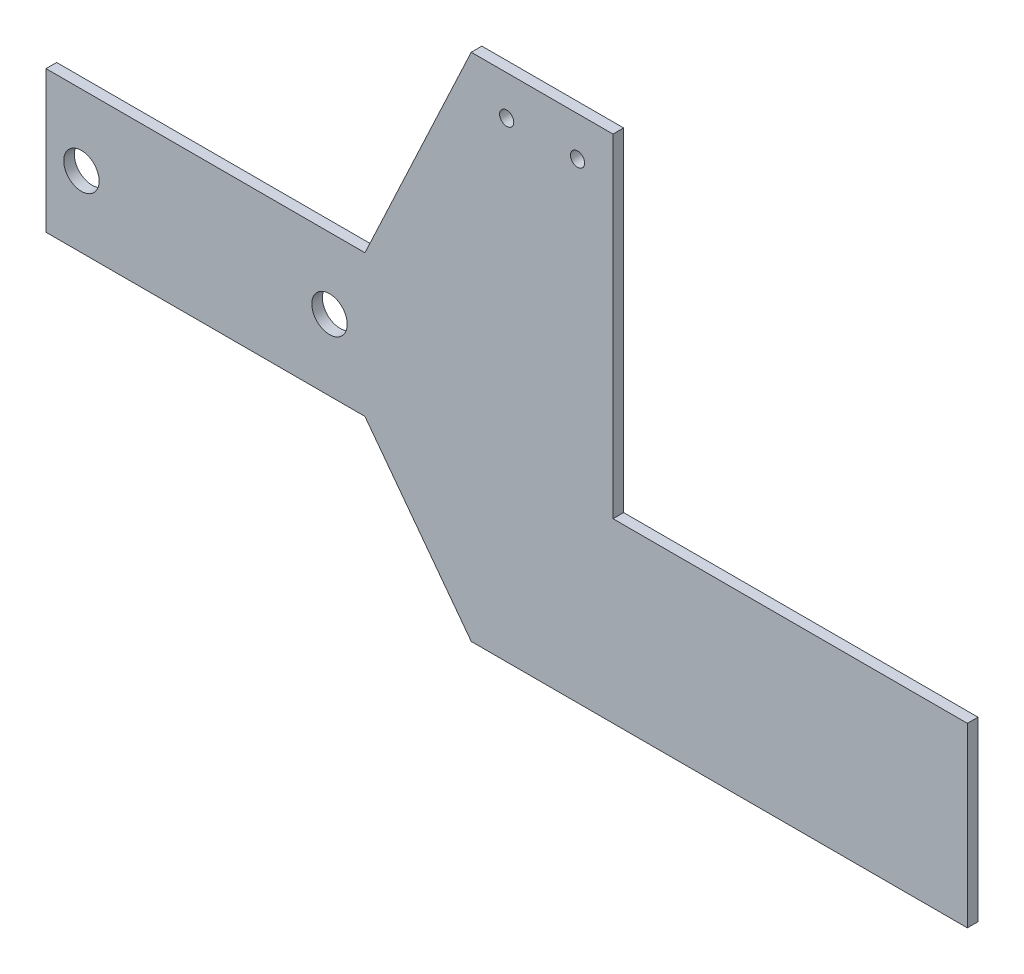
ISO-10303-21;
HEADER;
FILE_DESCRIPTION(('STEP AP214'),'2;1');
FILE_NAME('part.step','',(''),(''),'','','');
FILE_SCHEMA(('AUTOMOTIVE_DESIGN { 1 0 10303 214 1 1 1 1 }'));
ENDSEC;
DATA;
#1=APPLICATION_CONTEXT('core data for automotive mechanical design processes');
#2=APPLICATION_PROTOCOL_DEFINITION('international standard','automotive_design',2000,#1);
#3=PRODUCT_CONTEXT('',#1,'mechanical');
#4=PRODUCT('Part','Part','',(#3));
#5=PRODUCT_RELATED_PRODUCT_CATEGORY('part','',(#4));
#6=PRODUCT_DEFINITION_FORMATION('','',#4);
#7=PRODUCT_DEFINITION_CONTEXT('part definition',#1,'design');
#8=PRODUCT_DEFINITION('design','',#6,#7);
#9=PRODUCT_DEFINITION_SHAPE('','',#8);
#10=(LENGTH_UNIT() NAMED_UNIT(*) SI_UNIT(.MILLI.,.METRE.));
#11=(NAMED_UNIT(*) PLANE_ANGLE_UNIT() SI_UNIT($,.RADIAN.));
#12=(NAMED_UNIT(*) SI_UNIT($,.STERADIAN.) SOLID_ANGLE_UNIT());
#13=UNCERTAINTY_MEASURE_WITH_UNIT(LENGTH_MEASURE(1.E-05),#10,'distance_accuracy_value','');
#14=(GEOMETRIC_REPRESENTATION_CONTEXT(3) GLOBAL_UNCERTAINTY_ASSIGNED_CONTEXT((#13)) GLOBAL_UNIT_ASSIGNED_CONTEXT((#10,
#11,#12)) REPRESENTATION_CONTEXT('',''));
#15=CARTESIAN_POINT('',(0.,0.,0.));
#16=DIRECTION('',(0.,0.,1.));
#17=DIRECTION('',(1.,0.,0.));
#18=AXIS2_PLACEMENT_3D('',#15,#16,#17);
#19=CARTESIAN_POINT('',(0.,40.,1.5));
#20=DIRECTION('',(0.,-1.,0.));
#21=DIRECTION('',(0.,0.,-1.));
#22=AXIS2_PLACEMENT_3D('',#19,#20,#21);
#23=PLANE('',#22);
#24=DIRECTION('',(-1.,0.,0.));
#25=VECTOR('',#24,1.);
#26=CARTESIAN_POINT('',(0.,40.,0.));
#27=LINE('',#26,#25);
#28=CARTESIAN_POINT('',(-35.,40.,0.));
#29=VERTEX_POINT('',#28);
#30=CARTESIAN_POINT('',(-80.,40.,0.));
#31=VERTEX_POINT('',#30);
#32=EDGE_CURVE('E157',#29,#31,#27,.T.);
#33=ORIENTED_EDGE('',*,*,#32,.T.);
#34=DIRECTION('',(0.,0.,-1.));
#35=VECTOR('',#34,1.);
#36=CARTESIAN_POINT('',(-80.,40.,1.5));
#37=LINE('',#36,#35);
#38=CARTESIAN_POINT('',(-80.,40.,1.5));
#39=VERTEX_POINT('',#38);
#40=EDGE_CURVE('E11',#39,#31,#37,.T.);
#41=ORIENTED_EDGE('',*,*,#40,.F.);
#42=DIRECTION('',(-1.,0.,0.));
#43=VECTOR('',#42,1.);
#44=CARTESIAN_POINT('',(0.,40.,1.5));
#45=LINE('',#44,#43);
#46=CARTESIAN_POINT('',(-35.,40.,1.5));
#47=VERTEX_POINT('',#46);
#48=EDGE_CURVE('E222',#47,#39,#45,.T.);
#49=ORIENTED_EDGE('',*,*,#48,.F.);
#50=DIRECTION('',(0.,0.,-1.));
#51=VECTOR('',#50,1.);
#52=CARTESIAN_POINT('',(-35.,40.,1.5));
#53=LINE('',#52,#51);
#54=EDGE_CURVE('E150',#47,#29,#53,.T.);
#55=ORIENTED_EDGE('',*,*,#54,.T.);
#56=EDGE_LOOP('',(#33,#41,#49,#55));
#57=FACE_BOUND('',#56,.T.);
#58=ADVANCED_FACE('F36',(#57),#23,.F.);
#59=CARTESIAN_POINT('',(-80.,0.,1.5));
#60=DIRECTION('',(1.,0.,0.));
#61=DIRECTION('',(0.,0.,-1.));
#62=AXIS2_PLACEMENT_3D('',#59,#60,#61);
#63=PLANE('',#62);
#64=DIRECTION('',(0.,-1.,0.));
#65=VECTOR('',#64,1.);
#66=CARTESIAN_POINT('',(-80.,0.,0.));
#67=LINE('',#66,#65);
#68=CARTESIAN_POINT('',(-80.,20.,0.));
#69=VERTEX_POINT('',#68);
#70=EDGE_CURVE('E160',#31,#69,#67,.T.);
#71=ORIENTED_EDGE('',*,*,#70,.T.);
#72=DIRECTION('',(0.,0.,-1.));
#73=VECTOR('',#72,1.);
#74=CARTESIAN_POINT('',(-80.,20.,1.5));
#75=LINE('',#74,#73);
#76=CARTESIAN_POINT('',(-80.,20.,1.5));
#77=VERTEX_POINT('',#76);
#78=EDGE_CURVE('E45',#77,#69,#75,.T.);
#79=ORIENTED_EDGE('',*,*,#78,.F.);
#80=DIRECTION('',(0.,-1.,0.));
#81=VECTOR('',#80,1.);
#82=CARTESIAN_POINT('',(-80.,0.,1.5));
#83=LINE('',#82,#81);
#84=EDGE_CURVE('E98',#39,#77,#83,.T.);
#85=ORIENTED_EDGE('',*,*,#84,.F.);
#86=ORIENTED_EDGE('',*,*,#40,.T.);
#87=EDGE_LOOP('',(#71,#79,#85,#86));
#88=FACE_BOUND('',#87,.T.);
#89=ADVANCED_FACE('F205',(#88),#63,.F.);
#90=CARTESIAN_POINT('',(0.,20.,1.5));
#91=DIRECTION('',(0.,-1.,0.));
#92=DIRECTION('',(1.,0.,0.));
#93=AXIS2_PLACEMENT_3D('',#90,#91,#92);
#94=PLANE('',#93);
#95=DIRECTION('',(-1.,0.,0.));
#96=VECTOR('',#95,1.);
#97=CARTESIAN_POINT('',(0.,20.,0.));
#98=LINE('',#97,#96);
#99=CARTESIAN_POINT('',(-35.,20.,0.));
#100=VERTEX_POINT('',#99);
#101=EDGE_CURVE('E163',#100,#69,#98,.T.);
#102=ORIENTED_EDGE('',*,*,#101,.F.);
#103=DIRECTION('',(0.,0.,-1.));
#104=VECTOR('',#103,1.);
#105=CARTESIAN_POINT('',(-35.,20.,1.5));
#106=LINE('',#105,#104);
#107=CARTESIAN_POINT('',(-35.,20.,1.5));
#108=VERTEX_POINT('',#107);
#109=EDGE_CURVE('E198',#108,#100,#106,.T.);
#110=ORIENTED_EDGE('',*,*,#109,.F.);
#111=DIRECTION('',(-1.,0.,0.));
#112=VECTOR('',#111,1.);
#113=CARTESIAN_POINT('',(0.,20.,1.5));
#114=LINE('',#113,#112);
#115=EDGE_CURVE('E204',#108,#77,#114,.T.);
#116=ORIENTED_EDGE('',*,*,#115,.T.);
#117=ORIENTED_EDGE('',*,*,#78,.T.);
#118=EDGE_LOOP('',(#102,#110,#116,#117));
#119=FACE_BOUND('',#118,.T.);
#120=ADVANCED_FACE('F202',(#119),#94,.T.);
#121=CARTESIAN_POINT('',(-12.8,-9.6,1.5));
#122=DIRECTION('',(-0.8,-0.6,0.));
#123=DIRECTION('',(0.6,-0.8,0.));
#124=AXIS2_PLACEMENT_3D('',#121,#122,#123);
#125=PLANE('',#124);
#126=DIRECTION('',(-0.6,0.8,0.));
#127=VECTOR('',#126,1.);
#128=CARTESIAN_POINT('',(-12.8,-9.6,0.));
#129=LINE('',#128,#127);
#130=CARTESIAN_POINT('',(-20.,0.,0.));
#131=VERTEX_POINT('',#130);
#132=EDGE_CURVE('E166',#131,#100,#129,.T.);
#133=ORIENTED_EDGE('',*,*,#132,.F.);
#134=DIRECTION('',(0.,0.,-1.));
#135=VECTOR('',#134,1.);
#136=CARTESIAN_POINT('',(-20.,0.,1.5));
#137=LINE('',#136,#135);
#138=CARTESIAN_POINT('',(-20.,0.,1.5));
#139=VERTEX_POINT('',#138);
#140=EDGE_CURVE('E196',#139,#131,#137,.T.);
#141=ORIENTED_EDGE('',*,*,#140,.F.);
#142=DIRECTION('',(-0.6,0.8,0.));
#143=VECTOR('',#142,1.);
#144=CARTESIAN_POINT('',(-12.8,-9.6,1.5));
#145=LINE('',#144,#143);
#146=EDGE_CURVE('E218',#139,#108,#145,.T.);
#147=ORIENTED_EDGE('',*,*,#146,.T.);
#148=ORIENTED_EDGE('',*,*,#109,.T.);
#149=EDGE_LOOP('',(#133,#141,#147,#148));
#150=FACE_BOUND('',#149,.T.);
#151=ADVANCED_FACE('F214',(#150),#125,.T.);
#152=CARTESIAN_POINT('',(0.,0.,1.5));
#153=DIRECTION('',(0.,1.,0.));
#154=DIRECTION('',(0.,0.,1.));
#155=AXIS2_PLACEMENT_3D('',#152,#153,#154);
#156=PLANE('',#155);
#157=DIRECTION('',(1.,0.,0.));
#158=VECTOR('',#157,1.);
#159=CARTESIAN_POINT('',(0.,0.,0.));
#160=LINE('',#159,#158);
#161=CARTESIAN_POINT('',(50.,0.,0.));
#162=VERTEX_POINT('',#161);
#163=EDGE_CURVE('E169',#131,#162,#160,.T.);
#164=ORIENTED_EDGE('',*,*,#163,.T.);
#165=DIRECTION('',(0.,0.,-1.));
#166=VECTOR('',#165,1.);
#167=CARTESIAN_POINT('',(50.,0.,1.5));
#168=LINE('',#167,#166);
#169=CARTESIAN_POINT('',(50.,0.,1.5));
#170=VERTEX_POINT('',#169);
#171=EDGE_CURVE('E194',#170,#162,#168,.T.);
#172=ORIENTED_EDGE('',*,*,#171,.F.);
#173=DIRECTION('',(1.,0.,0.));
#174=VECTOR('',#173,1.);
#175=CARTESIAN_POINT('',(0.,0.,1.5));
#176=LINE('',#175,#174);
#177=EDGE_CURVE('E220',#139,#170,#176,.T.);
#178=ORIENTED_EDGE('',*,*,#177,.F.);
#179=ORIENTED_EDGE('',*,*,#140,.T.);
#180=EDGE_LOOP('',(#164,#172,#178,#179));
#181=FACE_BOUND('',#180,.T.);
#182=ADVANCED_FACE('F259',(#181),#156,.F.);
#183=CARTESIAN_POINT('',(50.,0.,1.5));
#184=DIRECTION('',(1.,0.,0.));
#185=DIRECTION('',(0.,0.,-1.));
#186=AXIS2_PLACEMENT_3D('',#183,#184,#185);
#187=PLANE('',#186);
#188=DIRECTION('',(0.,-1.,0.));
#189=VECTOR('',#188,1.);
#190=CARTESIAN_POINT('',(50.,0.,0.));
#191=LINE('',#190,#189);
#192=CARTESIAN_POINT('',(50.,25.,0.));
#193=VERTEX_POINT('',#192);
#194=EDGE_CURVE('E172',#193,#162,#191,.T.);
#195=ORIENTED_EDGE('',*,*,#194,.F.);
#196=DIRECTION('',(0.,0.,-1.));
#197=VECTOR('',#196,1.);
#198=CARTESIAN_POINT('',(50.,25.,1.5));
#199=LINE('',#198,#197);
#200=CARTESIAN_POINT('',(50.,25.,1.5));
#201=VERTEX_POINT('',#200);
#202=EDGE_CURVE('E192',#201,#193,#199,.T.);
#203=ORIENTED_EDGE('',*,*,#202,.F.);
#204=DIRECTION('',(0.,-1.,0.));
#205=VECTOR('',#204,1.);
#206=CARTESIAN_POINT('',(50.,0.,1.5));
#207=LINE('',#206,#205);
#208=EDGE_CURVE('E227',#201,#170,#207,.T.);
#209=ORIENTED_EDGE('',*,*,#208,.T.);
#210=ORIENTED_EDGE('',*,*,#171,.T.);
#211=EDGE_LOOP('',(#195,#203,#209,#210));
#212=FACE_BOUND('',#211,.T.);
#213=ADVANCED_FACE('F262',(#212),#187,.T.);
#214=CARTESIAN_POINT('',(0.,25.,1.5));
#215=DIRECTION('',(0.,1.,0.));
#216=DIRECTION('',(0.,0.,1.));
#217=AXIS2_PLACEMENT_3D('',#214,#215,#216);
#218=PLANE('',#217);
#219=DIRECTION('',(1.,0.,0.));
#220=VECTOR('',#219,1.);
#221=CARTESIAN_POINT('',(0.,25.,0.));
#222=LINE('',#221,#220);
#223=CARTESIAN_POINT('',(0.,25.,0.));
#224=VERTEX_POINT('',#223);
#225=EDGE_CURVE('E175',#224,#193,#222,.T.);
#226=ORIENTED_EDGE('',*,*,#225,.F.);
#227=DIRECTION('',(0.,0.,-1.));
#228=VECTOR('',#227,1.);
#229=CARTESIAN_POINT('',(0.,25.,1.5));
#230=LINE('',#229,#228);
#231=CARTESIAN_POINT('',(0.,25.,1.5));
#232=VERTEX_POINT('',#231);
#233=EDGE_CURVE('E129',#232,#224,#230,.T.);
#234=ORIENTED_EDGE('',*,*,#233,.F.);
#235=DIRECTION('',(1.,0.,0.));
#236=VECTOR('',#235,1.);
#237=CARTESIAN_POINT('',(0.,25.,1.5));
#238=LINE('',#237,#236);
#239=EDGE_CURVE('E137',#232,#201,#238,.T.);
#240=ORIENTED_EDGE('',*,*,#239,.T.);
#241=ORIENTED_EDGE('',*,*,#202,.T.);
#242=EDGE_LOOP('',(#226,#234,#240,#241));
#243=FACE_BOUND('',#242,.T.);
#244=ADVANCED_FACE('F231',(#243),#218,.T.);
#245=CARTESIAN_POINT('',(0.,0.,1.5));
#246=DIRECTION('',(1.,0.,0.));
#247=DIRECTION('',(0.,0.,-1.));
#248=AXIS2_PLACEMENT_3D('',#245,#246,#247);
#249=PLANE('',#248);
#250=DIRECTION('',(0.,-1.,0.));
#251=VECTOR('',#250,1.);
#252=CARTESIAN_POINT('',(0.,0.,0.));
#253=LINE('',#252,#251);
#254=CARTESIAN_POINT('',(0.,72.,0.));
#255=VERTEX_POINT('',#254);
#256=EDGE_CURVE('E124',#255,#224,#253,.T.);
#257=ORIENTED_EDGE('',*,*,#256,.F.);
#258=DIRECTION('',(0.,0.,-1.));
#259=VECTOR('',#258,1.);
#260=CARTESIAN_POINT('',(0.,72.,1.5));
#261=LINE('',#260,#259);
#262=CARTESIAN_POINT('',(0.,72.,1.5));
#263=VERTEX_POINT('',#262);
#264=EDGE_CURVE('E119',#263,#255,#261,.T.);
#265=ORIENTED_EDGE('',*,*,#264,.F.);
#266=DIRECTION('',(0.,-1.,0.));
#267=VECTOR('',#266,1.);
#268=CARTESIAN_POINT('',(0.,0.,1.5));
#269=LINE('',#268,#267);
#270=EDGE_CURVE('E122',#263,#232,#269,.T.);
#271=ORIENTED_EDGE('',*,*,#270,.T.);
#272=ORIENTED_EDGE('',*,*,#233,.T.);
#273=EDGE_LOOP('',(#257,#265,#271,#272));
#274=FACE_BOUND('',#273,.T.);
#275=ADVANCED_FACE('F121',(#274),#249,.T.);
#276=CARTESIAN_POINT('',(0.,72.,1.5));
#277=DIRECTION('',(0.,1.,0.));
#278=DIRECTION('',(0.,0.,1.));
#279=AXIS2_PLACEMENT_3D('',#276,#277,#278);
#280=PLANE('',#279);
#281=DIRECTION('',(1.,0.,0.));
#282=VECTOR('',#281,1.);
#283=CARTESIAN_POINT('',(0.,72.,0.));
#284=LINE('',#283,#282);
#285=CARTESIAN_POINT('',(-20.,72.,0.));
#286=VERTEX_POINT('',#285);
#287=EDGE_CURVE('E179',#286,#255,#284,.T.);
#288=ORIENTED_EDGE('',*,*,#287,.F.);
#289=DIRECTION('',(0.,0.,-1.));
#290=VECTOR('',#289,1.);
#291=CARTESIAN_POINT('',(-20.,72.,1.5));
#292=LINE('',#291,#290);
#293=CARTESIAN_POINT('',(-20.,72.,1.5));
#294=VERTEX_POINT('',#293);
#295=EDGE_CURVE('E87',#294,#286,#292,.T.);
#296=ORIENTED_EDGE('',*,*,#295,.F.);
#297=DIRECTION('',(1.,0.,0.));
#298=VECTOR('',#297,1.);
#299=CARTESIAN_POINT('',(0.,72.,1.5));
#300=LINE('',#299,#298);
#301=EDGE_CURVE('E134',#294,#263,#300,.T.);
#302=ORIENTED_EDGE('',*,*,#301,.T.);
#303=ORIENTED_EDGE('',*,*,#264,.T.);
#304=EDGE_LOOP('',(#288,#296,#302,#303));
#305=FACE_BOUND('',#304,.T.);
#306=ADVANCED_FACE('F139',(#305),#280,.T.);
#307=CARTESIAN_POINT('',(-15.,66.44,1.5));
#308=DIRECTION('',(0.,0.,-1.));
#309=DIRECTION('',(-1.,0.,0.));
#310=AXIS2_PLACEMENT_3D('',#307,#308,#309);
#311=CYLINDRICAL_SURFACE('',#310,1.);
#312=CARTESIAN_POINT('',(-15.,66.44,1.5));
#313=DIRECTION('',(0.,0.,1.));
#314=DIRECTION('',(1.,0.,0.));
#315=AXIS2_PLACEMENT_3D('',#312,#313,#314);
#316=CIRCLE('',#315,1.);
#317=CARTESIAN_POINT('',(-14.,66.44,1.5));
#318=VERTEX_POINT('',#317);
#319=EDGE_CURVE('E141',#318,#318,#316,.T.);
#320=ORIENTED_EDGE('',*,*,#319,.T.);
#321=EDGE_LOOP('',(#320));
#322=FACE_BOUND('',#321,.T.);
#323=CARTESIAN_POINT('',(-15.,66.44,0.));
#324=DIRECTION('',(0.,0.,1.));
#325=DIRECTION('',(1.,0.,0.));
#326=AXIS2_PLACEMENT_3D('',#323,#324,#325);
#327=CIRCLE('',#326,1.);
#328=CARTESIAN_POINT('',(-14.,66.44,0.));
#329=VERTEX_POINT('',#328);
#330=EDGE_CURVE('E182',#329,#329,#327,.T.);
#331=ORIENTED_EDGE('',*,*,#330,.F.);
#332=EDGE_LOOP('',(#331));
#333=FACE_BOUND('',#332,.T.);
#334=ADVANCED_FACE('F238',(#322,#333),#311,.F.);
#335=CARTESIAN_POINT('',(-44.0672538030424,20.6565252201761,1.5));
#336=DIRECTION('',(0.905458935958869,-0.424433876230719,0.));
#337=DIRECTION('',(0.424433876230719,0.905458935958869,0.));
#338=AXIS2_PLACEMENT_3D('',#335,#336,#337);
#339=PLANE('',#338);
#340=DIRECTION('',(-0.424433876230719,-0.905458935958869,0.));
#341=VECTOR('',#340,1.);
#342=CARTESIAN_POINT('',(-44.0672538030424,20.6565252201761,0.));
#343=LINE('',#342,#341);
#344=EDGE_CURVE('E90',#286,#29,#343,.T.);
#345=ORIENTED_EDGE('',*,*,#344,.T.);
#346=ORIENTED_EDGE('',*,*,#54,.F.);
#347=DIRECTION('',(-0.424433876230719,-0.905458935958869,0.));
#348=VECTOR('',#347,1.);
#349=CARTESIAN_POINT('',(-44.0672538030424,20.6565252201761,1.5));
#350=LINE('',#349,#348);
#351=EDGE_CURVE('E53',#294,#47,#350,.T.);
#352=ORIENTED_EDGE('',*,*,#351,.F.);
#353=ORIENTED_EDGE('',*,*,#295,.T.);
#354=EDGE_LOOP('',(#345,#346,#352,#353));
#355=FACE_BOUND('',#354,.T.);
#356=ADVANCED_FACE('F235',(#355),#339,.F.);
#357=CARTESIAN_POINT('',(-40.,30.,1.5));
#358=DIRECTION('',(0.,0.,-1.));
#359=DIRECTION('',(-1.,0.,0.));
#360=AXIS2_PLACEMENT_3D('',#357,#358,#359);
#361=CYLINDRICAL_SURFACE('',#360,2.5);
#362=CARTESIAN_POINT('',(-40.,30.,1.5));
#363=DIRECTION('',(0.,0.,1.));
#364=DIRECTION('',(1.,0.,0.));
#365=AXIS2_PLACEMENT_3D('',#362,#363,#364);
#366=CIRCLE('',#365,2.5);
#367=CARTESIAN_POINT('',(-37.5,30.,1.5));
#368=VERTEX_POINT('',#367);
#369=EDGE_CURVE('E363',#368,#368,#366,.T.);
#370=ORIENTED_EDGE('',*,*,#369,.T.);
#371=EDGE_LOOP('',(#370));
#372=FACE_BOUND('',#371,.T.);
#373=CARTESIAN_POINT('',(-40.,30.,0.));
#374=DIRECTION('',(0.,0.,1.));
#375=DIRECTION('',(1.,0.,0.));
#376=AXIS2_PLACEMENT_3D('',#373,#374,#375);
#377=CIRCLE('',#376,2.5);
#378=CARTESIAN_POINT('',(-37.5,30.,0.));
#379=VERTEX_POINT('',#378);
#380=EDGE_CURVE('E154',#379,#379,#377,.T.);
#381=ORIENTED_EDGE('',*,*,#380,.F.);
#382=EDGE_LOOP('',(#381));
#383=FACE_BOUND('',#382,.T.);
#384=ADVANCED_FACE('F237',(#372,#383),#361,.F.);
#385=CARTESIAN_POINT('',(-75.,30.,1.5));
#386=DIRECTION('',(0.,0.,-1.));
#387=DIRECTION('',(-1.,0.,0.));
#388=AXIS2_PLACEMENT_3D('',#385,#386,#387);
#389=CYLINDRICAL_SURFACE('',#388,2.50000000000001);
#390=CARTESIAN_POINT('',(-75.,30.,1.5));
#391=DIRECTION('',(0.,0.,1.));
#392=DIRECTION('',(1.,0.,0.));
#393=AXIS2_PLACEMENT_3D('',#390,#391,#392);
#394=CIRCLE('',#393,2.50000000000001);
#395=CARTESIAN_POINT('',(-72.5,30.,1.5));
#396=VERTEX_POINT('',#395);
#397=EDGE_CURVE('E188',#396,#396,#394,.T.);
#398=ORIENTED_EDGE('',*,*,#397,.T.);
#399=EDGE_LOOP('',(#398));
#400=FACE_BOUND('',#399,.T.);
#401=CARTESIAN_POINT('',(-75.,30.,0.));
#402=DIRECTION('',(0.,0.,1.));
#403=DIRECTION('',(1.,0.,0.));
#404=AXIS2_PLACEMENT_3D('',#401,#402,#403);
#405=CIRCLE('',#404,2.50000000000001);
#406=CARTESIAN_POINT('',(-72.5,30.,0.));
#407=VERTEX_POINT('',#406);
#408=EDGE_CURVE('E151',#407,#407,#405,.T.);
#409=ORIENTED_EDGE('',*,*,#408,.F.);
#410=EDGE_LOOP('',(#409));
#411=FACE_BOUND('',#410,.T.);
#412=ADVANCED_FACE('F38',(#400,#411),#389,.F.);
#413=CARTESIAN_POINT('',(-4.99999999999999,66.44,1.5));
#414=DIRECTION('',(0.,0.,-1.));
#415=DIRECTION('',(-1.,0.,0.));
#416=AXIS2_PLACEMENT_3D('',#413,#414,#415);
#417=CYLINDRICAL_SURFACE('',#416,1.);
#418=CARTESIAN_POINT('',(-4.99999999999999,66.44,1.5));
#419=DIRECTION('',(0.,0.,1.));
#420=DIRECTION('',(1.,0.,0.));
#421=AXIS2_PLACEMENT_3D('',#418,#419,#420);
#422=CIRCLE('',#421,1.);
#423=CARTESIAN_POINT('',(-3.99999999999999,66.44,1.5));
#424=VERTEX_POINT('',#423);
#425=EDGE_CURVE('E147',#424,#424,#422,.T.);
#426=ORIENTED_EDGE('',*,*,#425,.T.);
#427=EDGE_LOOP('',(#426));
#428=FACE_BOUND('',#427,.T.);
#429=CARTESIAN_POINT('',(-4.99999999999999,66.44,0.));
#430=DIRECTION('',(0.,0.,1.));
#431=DIRECTION('',(1.,0.,0.));
#432=AXIS2_PLACEMENT_3D('',#429,#430,#431);
#433=CIRCLE('',#432,1.);
#434=CARTESIAN_POINT('',(-3.99999999999999,66.44,0.));
#435=VERTEX_POINT('',#434);
#436=EDGE_CURVE('E185',#435,#435,#433,.T.);
#437=ORIENTED_EDGE('',*,*,#436,.F.);
#438=EDGE_LOOP('',(#437));
#439=FACE_BOUND('',#438,.T.);
#440=ADVANCED_FACE('F298',(#428,#439),#417,.F.);
#441=CARTESIAN_POINT('',(0.,0.,1.5));
#442=DIRECTION('',(0.,0.,1.));
#443=DIRECTION('',(1.,0.,0.));
#444=AXIS2_PLACEMENT_3D('',#441,#442,#443);
#445=PLANE('',#444);
#446=ORIENTED_EDGE('',*,*,#397,.F.);
#447=EDGE_LOOP('',(#446));
#448=FACE_BOUND('',#447,.T.);
#449=ORIENTED_EDGE('',*,*,#369,.F.);
#450=EDGE_LOOP('',(#449));
#451=FACE_BOUND('',#450,.T.);
#452=ORIENTED_EDGE('',*,*,#48,.T.);
#453=ORIENTED_EDGE('',*,*,#84,.T.);
#454=ORIENTED_EDGE('',*,*,#115,.F.);
#455=ORIENTED_EDGE('',*,*,#146,.F.);
#456=ORIENTED_EDGE('',*,*,#177,.T.);
#457=ORIENTED_EDGE('',*,*,#208,.F.);
#458=ORIENTED_EDGE('',*,*,#239,.F.);
#459=ORIENTED_EDGE('',*,*,#270,.F.);
#460=ORIENTED_EDGE('',*,*,#301,.F.);
#461=ORIENTED_EDGE('',*,*,#351,.T.);
#462=EDGE_LOOP('',(#452,#453,#454,#455,#456,#457,#458,#459,#460,#461));
#463=FACE_BOUND('',#462,.T.);
#464=ORIENTED_EDGE('',*,*,#319,.F.);
#465=EDGE_LOOP('',(#464));
#466=FACE_BOUND('',#465,.T.);
#467=ORIENTED_EDGE('',*,*,#425,.F.);
#468=EDGE_LOOP('',(#467));
#469=FACE_BOUND('',#468,.T.);
#470=ADVANCED_FACE('F132',(#448,#451,#463,#466,#469),#445,.T.);
#471=CARTESIAN_POINT('',(0.,0.,0.));
#472=DIRECTION('',(0.,0.,1.));
#473=DIRECTION('',(1.,0.,0.));
#474=AXIS2_PLACEMENT_3D('',#471,#472,#473);
#475=PLANE('',#474);
#476=ORIENTED_EDGE('',*,*,#408,.T.);
#477=EDGE_LOOP('',(#476));
#478=FACE_BOUND('',#477,.T.);
#479=ORIENTED_EDGE('',*,*,#380,.T.);
#480=EDGE_LOOP('',(#479));
#481=FACE_BOUND('',#480,.T.);
#482=ORIENTED_EDGE('',*,*,#32,.F.);
#483=ORIENTED_EDGE('',*,*,#344,.F.);
#484=ORIENTED_EDGE('',*,*,#287,.T.);
#485=ORIENTED_EDGE('',*,*,#256,.T.);
#486=ORIENTED_EDGE('',*,*,#225,.T.);
#487=ORIENTED_EDGE('',*,*,#194,.T.);
#488=ORIENTED_EDGE('',*,*,#163,.F.);
#489=ORIENTED_EDGE('',*,*,#132,.T.);
#490=ORIENTED_EDGE('',*,*,#101,.T.);
#491=ORIENTED_EDGE('',*,*,#70,.F.);
#492=EDGE_LOOP('',(#482,#483,#484,#485,#486,#487,#488,#489,#490,#491));
#493=FACE_BOUND('',#492,.T.);
#494=ORIENTED_EDGE('',*,*,#330,.T.);
#495=EDGE_LOOP('',(#494));
#496=FACE_BOUND('',#495,.T.);
#497=ORIENTED_EDGE('',*,*,#436,.T.);
#498=EDGE_LOOP('',(#497));
#499=FACE_BOUND('',#498,.T.);
#500=ADVANCED_FACE('F209',(#478,#481,#493,#496,#499),#475,.F.);
#501=CLOSED_SHELL('',(#58,#89,#120,#151,#182,#213,#244,#275,#306,#334,#356,#384,#412,#440,#470,#500));
#502=MANIFOLD_SOLID_BREP('B2',#501);
#503=ADVANCED_BREP_SHAPE_REPRESENTATION('',(#18,#502),#14);
#504=SHAPE_DEFINITION_REPRESENTATION(#9,#503);
ENDSEC;
END-ISO-10303-21;
